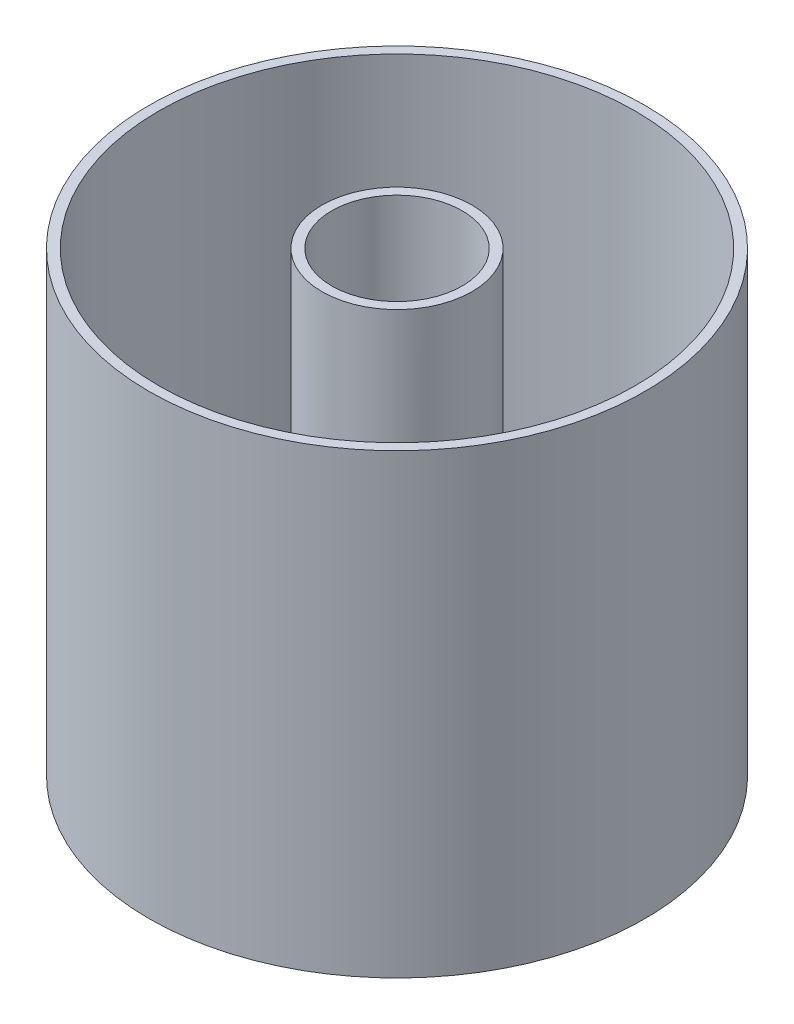
ISO-10303-21;
HEADER;
FILE_DESCRIPTION(('STEP AP214'),'2;1');
FILE_NAME('part.step','',(''),(''),'','','');
FILE_SCHEMA(('AUTOMOTIVE_DESIGN { 1 0 10303 214 1 1 1 1 }'));
ENDSEC;
DATA;
#1=APPLICATION_CONTEXT('core data for automotive mechanical design processes');
#2=APPLICATION_PROTOCOL_DEFINITION('international standard','automotive_design',2000,#1);
#3=PRODUCT_CONTEXT('',#1,'mechanical');
#4=PRODUCT('Part','Part','',(#3));
#5=PRODUCT_RELATED_PRODUCT_CATEGORY('part','',(#4));
#6=PRODUCT_DEFINITION_FORMATION('','',#4);
#7=PRODUCT_DEFINITION_CONTEXT('part definition',#1,'design');
#8=PRODUCT_DEFINITION('design','',#6,#7);
#9=PRODUCT_DEFINITION_SHAPE('','',#8);
#10=(LENGTH_UNIT() NAMED_UNIT(*) SI_UNIT(.MILLI.,.METRE.));
#11=(NAMED_UNIT(*) PLANE_ANGLE_UNIT() SI_UNIT($,.RADIAN.));
#12=(NAMED_UNIT(*) SI_UNIT($,.STERADIAN.) SOLID_ANGLE_UNIT());
#13=UNCERTAINTY_MEASURE_WITH_UNIT(LENGTH_MEASURE(1.E-05),#10,'distance_accuracy_value','');
#14=(GEOMETRIC_REPRESENTATION_CONTEXT(3) GLOBAL_UNCERTAINTY_ASSIGNED_CONTEXT((#13)) GLOBAL_UNIT_ASSIGNED_CONTEXT((#10,
#11,#12)) REPRESENTATION_CONTEXT('',''));
#15=CARTESIAN_POINT('',(0.,0.,0.));
#16=DIRECTION('',(0.,0.,1.));
#17=DIRECTION('',(1.,0.,0.));
#18=AXIS2_PLACEMENT_3D('',#15,#16,#17);
#19=CARTESIAN_POINT('',(0.,135.,0.));
#20=DIRECTION('',(0.,-1.,0.));
#21=DIRECTION('',(0.,0.,-1.));
#22=AXIS2_PLACEMENT_3D('',#19,#20,#21);
#23=CYLINDRICAL_SURFACE('',#22,73.);
#24=CARTESIAN_POINT('',(0.,135.,0.));
#25=DIRECTION('',(0.,1.,0.));
#26=DIRECTION('',(0.,0.,1.));
#27=AXIS2_PLACEMENT_3D('',#24,#25,#26);
#28=CIRCLE('',#27,73.);
#29=CARTESIAN_POINT('',(0.,135.,73.));
#30=VERTEX_POINT('',#29);
#31=EDGE_CURVE('E49',#30,#30,#28,.T.);
#32=ORIENTED_EDGE('',*,*,#31,.T.);
#33=EDGE_LOOP('',(#32));
#34=FACE_BOUND('',#33,.T.);
#35=CARTESIAN_POINT('',(0.,0.,0.));
#36=DIRECTION('',(0.,1.,0.));
#37=DIRECTION('',(0.,0.,1.));
#38=AXIS2_PLACEMENT_3D('',#35,#36,#37);
#39=CIRCLE('',#38,73.);
#40=CARTESIAN_POINT('',(0.,0.,73.));
#41=VERTEX_POINT('',#40);
#42=EDGE_CURVE('E54',#41,#41,#39,.T.);
#43=ORIENTED_EDGE('',*,*,#42,.F.);
#44=EDGE_LOOP('',(#43));
#45=FACE_BOUND('',#44,.T.);
#46=ADVANCED_FACE('F39',(#34,#45),#23,.F.);
#47=CARTESIAN_POINT('',(0.,135.,0.));
#48=DIRECTION('',(0.,-1.,0.));
#49=DIRECTION('',(0.,0.,-1.));
#50=AXIS2_PLACEMENT_3D('',#47,#48,#49);
#51=CYLINDRICAL_SURFACE('',#50,76.);
#52=CARTESIAN_POINT('',(0.,135.,0.));
#53=DIRECTION('',(0.,1.,0.));
#54=DIRECTION('',(0.,0.,1.));
#55=AXIS2_PLACEMENT_3D('',#52,#53,#54);
#56=CIRCLE('',#55,76.);
#57=CARTESIAN_POINT('',(0.,135.,76.));
#58=VERTEX_POINT('',#57);
#59=EDGE_CURVE('E45',#58,#58,#56,.T.);
#60=ORIENTED_EDGE('',*,*,#59,.F.);
#61=EDGE_LOOP('',(#60));
#62=FACE_BOUND('',#61,.T.);
#63=CARTESIAN_POINT('',(0.,-5.,0.));
#64=DIRECTION('',(0.,-1.,0.));
#65=DIRECTION('',(0.,0.,-1.));
#66=AXIS2_PLACEMENT_3D('',#63,#64,#65);
#67=CIRCLE('',#66,76.);
#68=CARTESIAN_POINT('',(0.,-5.,-76.));
#69=VERTEX_POINT('',#68);
#70=EDGE_CURVE('E58',#69,#69,#67,.T.);
#71=ORIENTED_EDGE('',*,*,#70,.F.);
#72=EDGE_LOOP('',(#71));
#73=FACE_BOUND('',#72,.T.);
#74=ADVANCED_FACE('F94',(#62,#73),#51,.T.);
#75=CARTESIAN_POINT('',(0.,135.,0.));
#76=DIRECTION('',(0.,1.,0.));
#77=DIRECTION('',(0.,0.,1.));
#78=AXIS2_PLACEMENT_3D('',#75,#76,#77);
#79=PLANE('',#78);
#80=ORIENTED_EDGE('',*,*,#31,.F.);
#81=EDGE_LOOP('',(#80));
#82=FACE_BOUND('',#81,.T.);
#83=ORIENTED_EDGE('',*,*,#59,.T.);
#84=EDGE_LOOP('',(#83));
#85=FACE_BOUND('',#84,.T.);
#86=ADVANCED_FACE('F99',(#82,#85),#79,.T.);
#87=CARTESIAN_POINT('',(0.,0.,0.));
#88=DIRECTION('',(0.,-1.,0.));
#89=DIRECTION('',(0.,0.,-1.));
#90=AXIS2_PLACEMENT_3D('',#87,#88,#89);
#91=PLANE('',#90);
#92=CARTESIAN_POINT('',(0.,0.,0.));
#93=DIRECTION('',(0.,-1.,0.));
#94=DIRECTION('',(0.,0.,-1.));
#95=AXIS2_PLACEMENT_3D('',#92,#93,#94);
#96=CIRCLE('',#95,23.);
#97=CARTESIAN_POINT('',(0.,0.,-23.));
#98=VERTEX_POINT('',#97);
#99=EDGE_CURVE('E11',#98,#98,#96,.F.);
#100=ORIENTED_EDGE('',*,*,#99,.F.);
#101=EDGE_LOOP('',(#100));
#102=FACE_BOUND('',#101,.T.);
#103=ORIENTED_EDGE('',*,*,#42,.T.);
#104=EDGE_LOOP('',(#103));
#105=FACE_BOUND('',#104,.T.);
#106=ADVANCED_FACE('F105',(#102,#105),#91,.F.);
#107=CARTESIAN_POINT('',(0.,-5.,0.));
#108=DIRECTION('',(0.,-1.,0.));
#109=DIRECTION('',(0.,0.,-1.));
#110=AXIS2_PLACEMENT_3D('',#107,#108,#109);
#111=PLANE('',#110);
#112=ORIENTED_EDGE('',*,*,#70,.T.);
#113=EDGE_LOOP('',(#112));
#114=FACE_BOUND('',#113,.T.);
#115=ADVANCED_FACE('F91',(#114),#111,.T.);
#116=CARTESIAN_POINT('',(0.,135.,0.));
#117=DIRECTION('',(0.,-1.,0.));
#118=DIRECTION('',(0.,0.,-1.));
#119=AXIS2_PLACEMENT_3D('',#116,#117,#118);
#120=CYLINDRICAL_SURFACE('',#119,20.);
#121=CARTESIAN_POINT('',(0.,135.,0.));
#122=DIRECTION('',(0.,1.,0.));
#123=DIRECTION('',(0.,0.,1.));
#124=AXIS2_PLACEMENT_3D('',#121,#122,#123);
#125=CIRCLE('',#124,20.);
#126=CARTESIAN_POINT('',(0.,135.,20.));
#127=VERTEX_POINT('',#126);
#128=EDGE_CURVE('E66',#127,#127,#125,.T.);
#129=ORIENTED_EDGE('',*,*,#128,.T.);
#130=EDGE_LOOP('',(#129));
#131=FACE_BOUND('',#130,.T.);
#132=CARTESIAN_POINT('',(0.,0.,0.));
#133=DIRECTION('',(0.,1.,0.));
#134=DIRECTION('',(0.,0.,1.));
#135=AXIS2_PLACEMENT_3D('',#132,#133,#134);
#136=CIRCLE('',#135,20.);
#137=CARTESIAN_POINT('',(0.,0.,20.));
#138=VERTEX_POINT('',#137);
#139=EDGE_CURVE('E69',#138,#138,#136,.T.);
#140=ORIENTED_EDGE('',*,*,#139,.F.);
#141=EDGE_LOOP('',(#140));
#142=FACE_BOUND('',#141,.T.);
#143=ADVANCED_FACE('F75',(#131,#142),#120,.F.);
#144=CARTESIAN_POINT('',(0.,135.,0.));
#145=DIRECTION('',(0.,-1.,0.));
#146=DIRECTION('',(0.,0.,-1.));
#147=AXIS2_PLACEMENT_3D('',#144,#145,#146);
#148=CYLINDRICAL_SURFACE('',#147,23.);
#149=CARTESIAN_POINT('',(0.,135.,0.));
#150=DIRECTION('',(0.,1.,0.));
#151=DIRECTION('',(0.,0.,1.));
#152=AXIS2_PLACEMENT_3D('',#149,#150,#151);
#153=CIRCLE('',#152,23.);
#154=CARTESIAN_POINT('',(0.,135.,23.));
#155=VERTEX_POINT('',#154);
#156=EDGE_CURVE('E62',#155,#155,#153,.T.);
#157=ORIENTED_EDGE('',*,*,#156,.F.);
#158=EDGE_LOOP('',(#157));
#159=FACE_BOUND('',#158,.T.);
#160=ORIENTED_EDGE('',*,*,#99,.T.);
#161=EDGE_LOOP('',(#160));
#162=FACE_BOUND('',#161,.T.);
#163=ADVANCED_FACE('F82',(#159,#162),#148,.T.);
#164=CARTESIAN_POINT('',(0.,135.,0.));
#165=DIRECTION('',(0.,1.,0.));
#166=DIRECTION('',(0.,0.,1.));
#167=AXIS2_PLACEMENT_3D('',#164,#165,#166);
#168=PLANE('',#167);
#169=ORIENTED_EDGE('',*,*,#128,.F.);
#170=EDGE_LOOP('',(#169));
#171=FACE_BOUND('',#170,.T.);
#172=ORIENTED_EDGE('',*,*,#156,.T.);
#173=EDGE_LOOP('',(#172));
#174=FACE_BOUND('',#173,.T.);
#175=ADVANCED_FACE('F78',(#171,#174),#168,.T.);
#176=ORIENTED_EDGE('',*,*,#139,.T.);
#177=EDGE_LOOP('',(#176));
#178=FACE_BOUND('',#177,.T.);
#179=ADVANCED_FACE('F81',(#178),#91,.F.);
#180=CLOSED_SHELL('',(#46,#74,#86,#106,#115,#143,#163,#175,#179));
#181=MANIFOLD_SOLID_BREP('B2',#180);
#182=ADVANCED_BREP_SHAPE_REPRESENTATION('',(#18,#181),#14);
#183=SHAPE_DEFINITION_REPRESENTATION(#9,#182);
ENDSEC;
END-ISO-10303-21;
